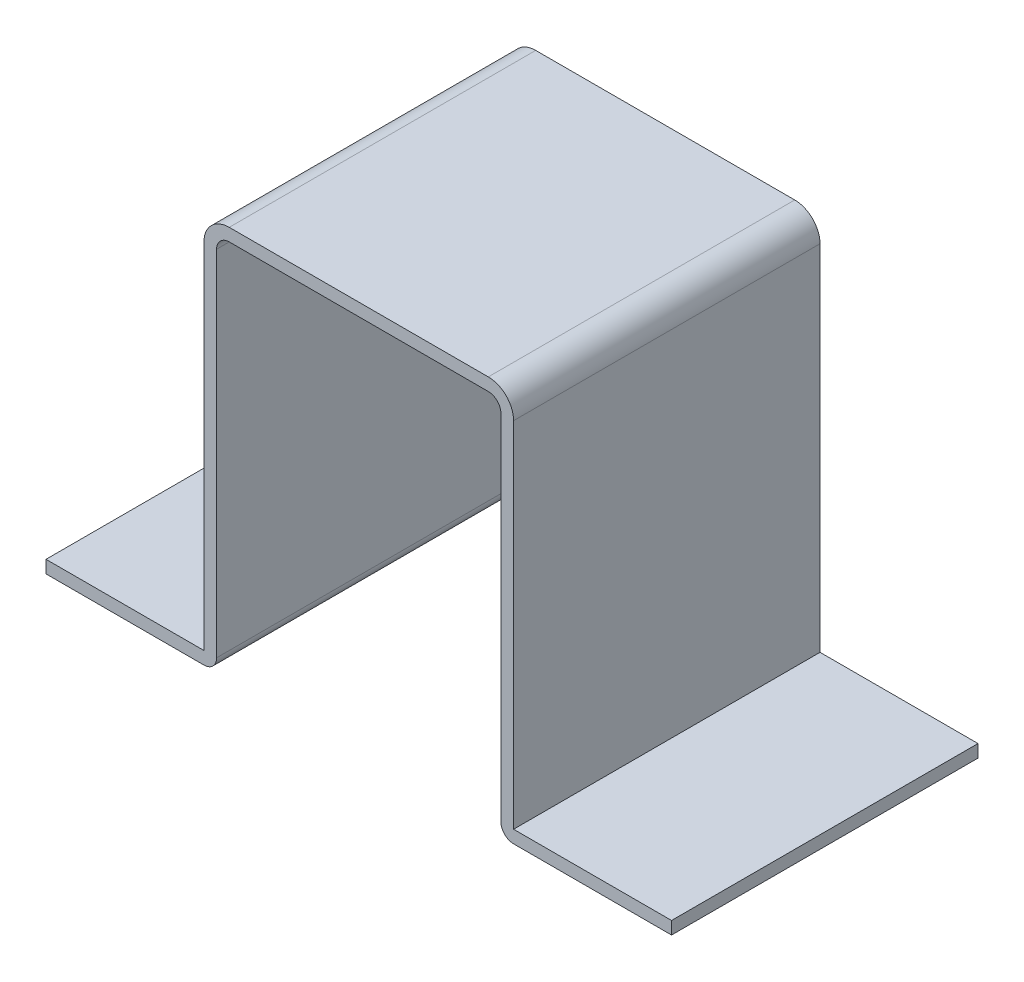
ISO-10303-21;
HEADER;
FILE_DESCRIPTION(('STEP AP214'),'2;1');
FILE_NAME('part.step','',(''),(''),'','','');
FILE_SCHEMA(('AUTOMOTIVE_DESIGN { 1 0 10303 214 1 1 1 1 }'));
ENDSEC;
DATA;
#1=APPLICATION_CONTEXT('core data for automotive mechanical design processes');
#2=APPLICATION_PROTOCOL_DEFINITION('international standard','automotive_design',2000,#1);
#3=PRODUCT_CONTEXT('',#1,'mechanical');
#4=PRODUCT('Part','Part','',(#3));
#5=PRODUCT_RELATED_PRODUCT_CATEGORY('part','',(#4));
#6=PRODUCT_DEFINITION_FORMATION('','',#4);
#7=PRODUCT_DEFINITION_CONTEXT('part definition',#1,'design');
#8=PRODUCT_DEFINITION('design','',#6,#7);
#9=PRODUCT_DEFINITION_SHAPE('','',#8);
#10=(LENGTH_UNIT() NAMED_UNIT(*) SI_UNIT(.MILLI.,.METRE.));
#11=(NAMED_UNIT(*) PLANE_ANGLE_UNIT() SI_UNIT($,.RADIAN.));
#12=(NAMED_UNIT(*) SI_UNIT($,.STERADIAN.) SOLID_ANGLE_UNIT());
#13=UNCERTAINTY_MEASURE_WITH_UNIT(LENGTH_MEASURE(1.E-05),#10,'distance_accuracy_value','');
#14=(GEOMETRIC_REPRESENTATION_CONTEXT(3) GLOBAL_UNCERTAINTY_ASSIGNED_CONTEXT((#13)) GLOBAL_UNIT_ASSIGNED_CONTEXT((#10,
#11,#12)) REPRESENTATION_CONTEXT('',''));
#15=CARTESIAN_POINT('',(0.,0.,0.));
#16=DIRECTION('',(0.,0.,1.));
#17=DIRECTION('',(1.,0.,0.));
#18=AXIS2_PLACEMENT_3D('',#15,#16,#17);
#19=CARTESIAN_POINT('',(24.5,-28.,24.25));
#20=DIRECTION('',(0.,0.,-1.));
#21=DIRECTION('',(-1.,0.,0.));
#22=AXIS2_PLACEMENT_3D('',#19,#20,#21);
#23=CYLINDRICAL_SURFACE('',#22,2.);
#24=CARTESIAN_POINT('',(24.5,-28.,24.25));
#25=DIRECTION('',(0.,0.,-1.));
#26=DIRECTION('',(-1.,0.,0.));
#27=AXIS2_PLACEMENT_3D('',#24,#25,#26);
#28=CIRCLE('',#27,2.);
#29=CARTESIAN_POINT('',(24.5,-30.,24.25));
#30=VERTEX_POINT('',#29);
#31=CARTESIAN_POINT('',(22.5,-28.,24.25));
#32=VERTEX_POINT('',#31);
#33=EDGE_CURVE('E172',#30,#32,#28,.T.);
#34=ORIENTED_EDGE('',*,*,#33,.T.);
#35=DIRECTION('',(0.,0.,-1.));
#36=VECTOR('',#35,1.);
#37=CARTESIAN_POINT('',(22.5,-28.,24.25));
#38=LINE('',#37,#36);
#39=CARTESIAN_POINT('',(22.5,-28.,-24.25));
#40=VERTEX_POINT('',#39);
#41=EDGE_CURVE('E214',#32,#40,#38,.T.);
#42=ORIENTED_EDGE('',*,*,#41,.T.);
#43=CARTESIAN_POINT('',(24.5,-28.,-24.25));
#44=DIRECTION('',(0.,0.,-1.));
#45=DIRECTION('',(-1.,0.,0.));
#46=AXIS2_PLACEMENT_3D('',#43,#44,#45);
#47=CIRCLE('',#46,2.);
#48=CARTESIAN_POINT('',(24.5,-30.,-24.25));
#49=VERTEX_POINT('',#48);
#50=EDGE_CURVE('E246',#49,#40,#47,.T.);
#51=ORIENTED_EDGE('',*,*,#50,.F.);
#52=DIRECTION('',(0.,0.,1.));
#53=VECTOR('',#52,1.);
#54=CARTESIAN_POINT('',(24.5,-30.,24.25));
#55=LINE('',#54,#53);
#56=EDGE_CURVE('E153',#49,#30,#55,.T.);
#57=ORIENTED_EDGE('',*,*,#56,.T.);
#58=EDGE_LOOP('',(#34,#42,#51,#57));
#59=FACE_BOUND('',#58,.T.);
#60=ADVANCED_FACE('F17',(#59),#23,.T.);
#61=CARTESIAN_POINT('',(22.5,-28.,24.25));
#62=DIRECTION('',(1.,0.,0.));
#63=DIRECTION('',(0.,0.,-1.));
#64=AXIS2_PLACEMENT_3D('',#61,#62,#63);
#65=PLANE('',#64);
#66=ORIENTED_EDGE('',*,*,#41,.F.);
#67=DIRECTION('',(0.,1.,0.));
#68=VECTOR('',#67,1.);
#69=CARTESIAN_POINT('',(22.5,-28.,24.25));
#70=LINE('',#69,#68);
#71=CARTESIAN_POINT('',(22.5,28.,24.25));
#72=VERTEX_POINT('',#71);
#73=EDGE_CURVE('E137',#32,#72,#70,.T.);
#74=ORIENTED_EDGE('',*,*,#73,.T.);
#75=DIRECTION('',(0.,0.,-1.));
#76=VECTOR('',#75,1.);
#77=CARTESIAN_POINT('',(22.5,28.,24.25));
#78=LINE('',#77,#76);
#79=CARTESIAN_POINT('',(22.5,28.,-24.25));
#80=VERTEX_POINT('',#79);
#81=EDGE_CURVE('E111',#72,#80,#78,.T.);
#82=ORIENTED_EDGE('',*,*,#81,.T.);
#83=DIRECTION('',(0.,1.,0.));
#84=VECTOR('',#83,1.);
#85=CARTESIAN_POINT('',(22.5,-28.,-24.25));
#86=LINE('',#85,#84);
#87=EDGE_CURVE('E245',#40,#80,#86,.T.);
#88=ORIENTED_EDGE('',*,*,#87,.F.);
#89=EDGE_LOOP('',(#66,#74,#82,#88));
#90=FACE_BOUND('',#89,.T.);
#91=ADVANCED_FACE('F318',(#90),#65,.F.);
#92=CARTESIAN_POINT('',(20.5,28.,24.25));
#93=DIRECTION('',(0.,0.,-1.));
#94=DIRECTION('',(-1.,0.,0.));
#95=AXIS2_PLACEMENT_3D('',#92,#93,#94);
#96=CYLINDRICAL_SURFACE('',#95,2.);
#97=ORIENTED_EDGE('',*,*,#81,.F.);
#98=CARTESIAN_POINT('',(20.5,28.,24.25));
#99=DIRECTION('',(0.,0.,-1.));
#100=DIRECTION('',(-1.,0.,0.));
#101=AXIS2_PLACEMENT_3D('',#98,#99,#100);
#102=CIRCLE('',#101,2.);
#103=CARTESIAN_POINT('',(20.5,30.,24.25));
#104=VERTEX_POINT('',#103);
#105=EDGE_CURVE('E20',#72,#104,#102,.F.);
#106=ORIENTED_EDGE('',*,*,#105,.T.);
#107=DIRECTION('',(0.,0.,1.));
#108=VECTOR('',#107,1.);
#109=CARTESIAN_POINT('',(20.5,30.,24.25));
#110=LINE('',#109,#108);
#111=CARTESIAN_POINT('',(20.5,30.,-24.25));
#112=VERTEX_POINT('',#111);
#113=EDGE_CURVE('E118',#104,#112,#110,.F.);
#114=ORIENTED_EDGE('',*,*,#113,.T.);
#115=CARTESIAN_POINT('',(20.5,28.,-24.25));
#116=DIRECTION('',(0.,0.,-1.));
#117=DIRECTION('',(-1.,0.,0.));
#118=AXIS2_PLACEMENT_3D('',#115,#116,#117);
#119=CIRCLE('',#118,2.);
#120=EDGE_CURVE('E243',#80,#112,#119,.F.);
#121=ORIENTED_EDGE('',*,*,#120,.F.);
#122=EDGE_LOOP('',(#97,#106,#114,#121));
#123=FACE_BOUND('',#122,.T.);
#124=ADVANCED_FACE('F136',(#123),#96,.F.);
#125=CARTESIAN_POINT('',(20.5,30.,24.25));
#126=DIRECTION('',(0.,1.,0.));
#127=DIRECTION('',(-1.,0.,0.));
#128=AXIS2_PLACEMENT_3D('',#125,#126,#127);
#129=PLANE('',#128);
#130=ORIENTED_EDGE('',*,*,#113,.F.);
#131=DIRECTION('',(-1.,0.,0.));
#132=VECTOR('',#131,1.);
#133=CARTESIAN_POINT('',(24.5,30.,24.25));
#134=LINE('',#133,#132);
#135=CARTESIAN_POINT('',(-20.5,30.,24.25));
#136=VERTEX_POINT('',#135);
#137=EDGE_CURVE('E122',#104,#136,#134,.T.);
#138=ORIENTED_EDGE('',*,*,#137,.T.);
#139=DIRECTION('',(0.,0.,-1.));
#140=VECTOR('',#139,1.);
#141=CARTESIAN_POINT('',(-20.5,30.,24.25));
#142=LINE('',#141,#140);
#143=CARTESIAN_POINT('',(-20.5,30.,-24.25));
#144=VERTEX_POINT('',#143);
#145=EDGE_CURVE('E124',#136,#144,#142,.T.);
#146=ORIENTED_EDGE('',*,*,#145,.T.);
#147=DIRECTION('',(-1.,0.,0.));
#148=VECTOR('',#147,1.);
#149=CARTESIAN_POINT('',(24.5,30.,-24.25));
#150=LINE('',#149,#148);
#151=EDGE_CURVE('E123',#112,#144,#150,.T.);
#152=ORIENTED_EDGE('',*,*,#151,.F.);
#153=EDGE_LOOP('',(#130,#138,#146,#152));
#154=FACE_BOUND('',#153,.T.);
#155=ADVANCED_FACE('F120',(#154),#129,.F.);
#156=CARTESIAN_POINT('',(-20.5,28.,24.25));
#157=DIRECTION('',(0.,0.,-1.));
#158=DIRECTION('',(-1.,0.,0.));
#159=AXIS2_PLACEMENT_3D('',#156,#157,#158);
#160=CYLINDRICAL_SURFACE('',#159,2.);
#161=ORIENTED_EDGE('',*,*,#145,.F.);
#162=CARTESIAN_POINT('',(-20.5,28.,24.25));
#163=DIRECTION('',(0.,0.,-1.));
#164=DIRECTION('',(-1.,0.,0.));
#165=AXIS2_PLACEMENT_3D('',#162,#163,#164);
#166=CIRCLE('',#165,2.);
#167=CARTESIAN_POINT('',(-22.5,28.,24.25));
#168=VERTEX_POINT('',#167);
#169=EDGE_CURVE('E134',#136,#168,#166,.F.);
#170=ORIENTED_EDGE('',*,*,#169,.T.);
#171=DIRECTION('',(0.,0.,1.));
#172=VECTOR('',#171,1.);
#173=CARTESIAN_POINT('',(-22.5,28.,24.25));
#174=LINE('',#173,#172);
#175=CARTESIAN_POINT('',(-22.5,28.,-24.25));
#176=VERTEX_POINT('',#175);
#177=EDGE_CURVE('E209',#168,#176,#174,.F.);
#178=ORIENTED_EDGE('',*,*,#177,.T.);
#179=CARTESIAN_POINT('',(-20.5,28.,-24.25));
#180=DIRECTION('',(0.,0.,-1.));
#181=DIRECTION('',(-1.,0.,0.));
#182=AXIS2_PLACEMENT_3D('',#179,#180,#181);
#183=CIRCLE('',#182,2.);
#184=EDGE_CURVE('E241',#144,#176,#183,.F.);
#185=ORIENTED_EDGE('',*,*,#184,.F.);
#186=EDGE_LOOP('',(#161,#170,#178,#185));
#187=FACE_BOUND('',#186,.T.);
#188=ADVANCED_FACE('F320',(#187),#160,.F.);
#189=CARTESIAN_POINT('',(-22.5,-28.,24.25));
#190=DIRECTION('',(-1.,0.,0.));
#191=DIRECTION('',(0.,0.,1.));
#192=AXIS2_PLACEMENT_3D('',#189,#190,#191);
#193=PLANE('',#192);
#194=ORIENTED_EDGE('',*,*,#177,.F.);
#195=DIRECTION('',(0.,1.,0.));
#196=VECTOR('',#195,1.);
#197=CARTESIAN_POINT('',(-22.5,-28.,24.25));
#198=LINE('',#197,#196);
#199=CARTESIAN_POINT('',(-22.5,-28.,24.25));
#200=VERTEX_POINT('',#199);
#201=EDGE_CURVE('E256',#168,#200,#198,.F.);
#202=ORIENTED_EDGE('',*,*,#201,.T.);
#203=DIRECTION('',(0.,0.,-1.));
#204=VECTOR('',#203,1.);
#205=CARTESIAN_POINT('',(-22.5,-28.,24.25));
#206=LINE('',#205,#204);
#207=CARTESIAN_POINT('',(-22.5,-28.,-24.25));
#208=VERTEX_POINT('',#207);
#209=EDGE_CURVE('E207',#208,#200,#206,.F.);
#210=ORIENTED_EDGE('',*,*,#209,.F.);
#211=DIRECTION('',(0.,1.,0.));
#212=VECTOR('',#211,1.);
#213=CARTESIAN_POINT('',(-22.5,-28.,-24.25));
#214=LINE('',#213,#212);
#215=EDGE_CURVE('E240',#176,#208,#214,.F.);
#216=ORIENTED_EDGE('',*,*,#215,.F.);
#217=EDGE_LOOP('',(#194,#202,#210,#216));
#218=FACE_BOUND('',#217,.T.);
#219=ADVANCED_FACE('F322',(#218),#193,.F.);
#220=CARTESIAN_POINT('',(-24.5,-28.,24.25));
#221=DIRECTION('',(0.,0.,-1.));
#222=DIRECTION('',(-1.,0.,0.));
#223=AXIS2_PLACEMENT_3D('',#220,#221,#222);
#224=CYLINDRICAL_SURFACE('',#223,2.);
#225=CARTESIAN_POINT('',(-24.5,-28.,24.25));
#226=DIRECTION('',(0.,0.,-1.));
#227=DIRECTION('',(-1.,0.,0.));
#228=AXIS2_PLACEMENT_3D('',#225,#226,#227);
#229=CIRCLE('',#228,2.);
#230=CARTESIAN_POINT('',(-24.5,-30.,24.25));
#231=VERTEX_POINT('',#230);
#232=EDGE_CURVE('E254',#200,#231,#229,.T.);
#233=ORIENTED_EDGE('',*,*,#232,.T.);
#234=DIRECTION('',(0.,0.,1.));
#235=VECTOR('',#234,1.);
#236=CARTESIAN_POINT('',(-24.5,-30.,24.25));
#237=LINE('',#236,#235);
#238=CARTESIAN_POINT('',(-24.5,-30.,-24.25));
#239=VERTEX_POINT('',#238);
#240=EDGE_CURVE('E202',#231,#239,#237,.F.);
#241=ORIENTED_EDGE('',*,*,#240,.T.);
#242=CARTESIAN_POINT('',(-24.5,-28.,-24.25));
#243=DIRECTION('',(0.,0.,-1.));
#244=DIRECTION('',(-1.,0.,0.));
#245=AXIS2_PLACEMENT_3D('',#242,#243,#244);
#246=CIRCLE('',#245,2.);
#247=EDGE_CURVE('E238',#208,#239,#246,.T.);
#248=ORIENTED_EDGE('',*,*,#247,.F.);
#249=ORIENTED_EDGE('',*,*,#209,.T.);
#250=EDGE_LOOP('',(#233,#241,#248,#249));
#251=FACE_BOUND('',#250,.T.);
#252=ADVANCED_FACE('F326',(#251),#224,.T.);
#253=CARTESIAN_POINT('',(-24.5,-30.,24.25));
#254=DIRECTION('',(0.,1.,0.));
#255=DIRECTION('',(-1.,0.,0.));
#256=AXIS2_PLACEMENT_3D('',#253,#254,#255);
#257=PLANE('',#256);
#258=ORIENTED_EDGE('',*,*,#240,.F.);
#259=DIRECTION('',(-1.,0.,0.));
#260=VECTOR('',#259,1.);
#261=CARTESIAN_POINT('',(24.5,-30.,24.25));
#262=LINE('',#261,#260);
#263=CARTESIAN_POINT('',(-49.5,-30.,24.25));
#264=VERTEX_POINT('',#263);
#265=EDGE_CURVE('E231',#231,#264,#262,.T.);
#266=ORIENTED_EDGE('',*,*,#265,.T.);
#267=DIRECTION('',(0.,0.,-1.));
#268=VECTOR('',#267,1.);
#269=CARTESIAN_POINT('',(-49.5,-30.,24.25));
#270=LINE('',#269,#268);
#271=CARTESIAN_POINT('',(-49.5,-30.,-24.25));
#272=VERTEX_POINT('',#271);
#273=EDGE_CURVE('E192',#264,#272,#270,.T.);
#274=ORIENTED_EDGE('',*,*,#273,.T.);
#275=DIRECTION('',(-1.,0.,0.));
#276=VECTOR('',#275,1.);
#277=CARTESIAN_POINT('',(24.5,-30.,-24.25));
#278=LINE('',#277,#276);
#279=EDGE_CURVE('E197',#239,#272,#278,.T.);
#280=ORIENTED_EDGE('',*,*,#279,.F.);
#281=EDGE_LOOP('',(#258,#266,#274,#280));
#282=FACE_BOUND('',#281,.T.);
#283=ADVANCED_FACE('F330',(#282),#257,.F.);
#284=CARTESIAN_POINT('',(-49.5,-28.,24.25));
#285=DIRECTION('',(1.,0.,0.));
#286=DIRECTION('',(0.,0.,-1.));
#287=AXIS2_PLACEMENT_3D('',#284,#285,#286);
#288=PLANE('',#287);
#289=ORIENTED_EDGE('',*,*,#273,.F.);
#290=DIRECTION('',(0.,1.,0.));
#291=VECTOR('',#290,1.);
#292=CARTESIAN_POINT('',(-49.5,-28.,24.25));
#293=LINE('',#292,#291);
#294=CARTESIAN_POINT('',(-49.5,-28.,24.25));
#295=VERTEX_POINT('',#294);
#296=EDGE_CURVE('E226',#264,#295,#293,.T.);
#297=ORIENTED_EDGE('',*,*,#296,.T.);
#298=DIRECTION('',(0.,0.,1.));
#299=VECTOR('',#298,1.);
#300=CARTESIAN_POINT('',(-49.5,-28.,24.25));
#301=LINE('',#300,#299);
#302=CARTESIAN_POINT('',(-49.5,-28.,-24.25));
#303=VERTEX_POINT('',#302);
#304=EDGE_CURVE('E180',#295,#303,#301,.F.);
#305=ORIENTED_EDGE('',*,*,#304,.T.);
#306=DIRECTION('',(0.,1.,0.));
#307=VECTOR('',#306,1.);
#308=CARTESIAN_POINT('',(-49.5,-28.,-24.25));
#309=LINE('',#308,#307);
#310=EDGE_CURVE('E187',#272,#303,#309,.T.);
#311=ORIENTED_EDGE('',*,*,#310,.F.);
#312=EDGE_LOOP('',(#289,#297,#305,#311));
#313=FACE_BOUND('',#312,.T.);
#314=ADVANCED_FACE('F337',(#313),#288,.F.);
#315=CARTESIAN_POINT('',(-24.5,-28.,24.25));
#316=DIRECTION('',(0.,-1.,0.));
#317=DIRECTION('',(1.,0.,0.));
#318=AXIS2_PLACEMENT_3D('',#315,#316,#317);
#319=PLANE('',#318);
#320=ORIENTED_EDGE('',*,*,#304,.F.);
#321=DIRECTION('',(-1.,0.,0.));
#322=VECTOR('',#321,1.);
#323=CARTESIAN_POINT('',(24.5,-28.,24.25));
#324=LINE('',#323,#322);
#325=CARTESIAN_POINT('',(-24.5,-28.,24.25));
#326=VERTEX_POINT('',#325);
#327=EDGE_CURVE('E222',#295,#326,#324,.F.);
#328=ORIENTED_EDGE('',*,*,#327,.T.);
#329=DIRECTION('',(0.,0.,-1.));
#330=VECTOR('',#329,1.);
#331=CARTESIAN_POINT('',(-24.5,-28.,24.25));
#332=LINE('',#331,#330);
#333=CARTESIAN_POINT('',(-24.5,-28.,-24.25));
#334=VERTEX_POINT('',#333);
#335=EDGE_CURVE('E177',#326,#334,#332,.T.);
#336=ORIENTED_EDGE('',*,*,#335,.T.);
#337=DIRECTION('',(-1.,0.,0.));
#338=VECTOR('',#337,1.);
#339=CARTESIAN_POINT('',(24.5,-28.,-24.25));
#340=LINE('',#339,#338);
#341=EDGE_CURVE('E183',#303,#334,#340,.F.);
#342=ORIENTED_EDGE('',*,*,#341,.F.);
#343=EDGE_LOOP('',(#320,#328,#336,#342));
#344=FACE_BOUND('',#343,.T.);
#345=ADVANCED_FACE('F355',(#344),#319,.F.);
#346=CARTESIAN_POINT('',(-24.5,-28.,24.25));
#347=DIRECTION('',(1.,0.,0.));
#348=DIRECTION('',(0.,0.,-1.));
#349=AXIS2_PLACEMENT_3D('',#346,#347,#348);
#350=PLANE('',#349);
#351=ORIENTED_EDGE('',*,*,#335,.F.);
#352=DIRECTION('',(0.,1.,0.));
#353=VECTOR('',#352,1.);
#354=CARTESIAN_POINT('',(-24.5,-28.,24.25));
#355=LINE('',#354,#353);
#356=CARTESIAN_POINT('',(-24.5,28.,24.25));
#357=VERTEX_POINT('',#356);
#358=EDGE_CURVE('E225',#326,#357,#355,.T.);
#359=ORIENTED_EDGE('',*,*,#358,.T.);
#360=DIRECTION('',(0.,0.,-1.));
#361=VECTOR('',#360,1.);
#362=CARTESIAN_POINT('',(-24.5,28.,24.25));
#363=LINE('',#362,#361);
#364=CARTESIAN_POINT('',(-24.5,28.,-24.25));
#365=VERTEX_POINT('',#364);
#366=EDGE_CURVE('E175',#365,#357,#363,.F.);
#367=ORIENTED_EDGE('',*,*,#366,.F.);
#368=DIRECTION('',(0.,1.,0.));
#369=VECTOR('',#368,1.);
#370=CARTESIAN_POINT('',(-24.5,-28.,-24.25));
#371=LINE('',#370,#369);
#372=EDGE_CURVE('E186',#334,#365,#371,.T.);
#373=ORIENTED_EDGE('',*,*,#372,.F.);
#374=EDGE_LOOP('',(#351,#359,#367,#373));
#375=FACE_BOUND('',#374,.T.);
#376=ADVANCED_FACE('F351',(#375),#350,.F.);
#377=CARTESIAN_POINT('',(-20.5,28.,24.25));
#378=DIRECTION('',(0.,0.,-1.));
#379=DIRECTION('',(-1.,0.,0.));
#380=AXIS2_PLACEMENT_3D('',#377,#378,#379);
#381=CYLINDRICAL_SURFACE('',#380,4.);
#382=CARTESIAN_POINT('',(-20.5,28.,24.25));
#383=DIRECTION('',(0.,0.,-1.));
#384=DIRECTION('',(-1.,0.,0.));
#385=AXIS2_PLACEMENT_3D('',#382,#383,#384);
#386=CIRCLE('',#385,4.);
#387=CARTESIAN_POINT('',(-20.5,32.,24.25));
#388=VERTEX_POINT('',#387);
#389=EDGE_CURVE('E251',#357,#388,#386,.T.);
#390=ORIENTED_EDGE('',*,*,#389,.T.);
#391=DIRECTION('',(0.,0.,-1.));
#392=VECTOR('',#391,1.);
#393=CARTESIAN_POINT('',(-20.5,32.,24.25));
#394=LINE('',#393,#392);
#395=CARTESIAN_POINT('',(-20.5,32.,-24.25));
#396=VERTEX_POINT('',#395);
#397=EDGE_CURVE('E155',#388,#396,#394,.T.);
#398=ORIENTED_EDGE('',*,*,#397,.T.);
#399=CARTESIAN_POINT('',(-20.5,28.,-24.25));
#400=DIRECTION('',(0.,0.,-1.));
#401=DIRECTION('',(-1.,0.,0.));
#402=AXIS2_PLACEMENT_3D('',#399,#400,#401);
#403=CIRCLE('',#402,4.);
#404=EDGE_CURVE('E236',#365,#396,#403,.T.);
#405=ORIENTED_EDGE('',*,*,#404,.F.);
#406=ORIENTED_EDGE('',*,*,#366,.T.);
#407=EDGE_LOOP('',(#390,#398,#405,#406));
#408=FACE_BOUND('',#407,.T.);
#409=ADVANCED_FACE('F363',(#408),#381,.T.);
#410=CARTESIAN_POINT('',(20.5,32.,24.25));
#411=DIRECTION('',(0.,-1.,0.));
#412=DIRECTION('',(0.,0.,-1.));
#413=AXIS2_PLACEMENT_3D('',#410,#411,#412);
#414=PLANE('',#413);
#415=ORIENTED_EDGE('',*,*,#397,.F.);
#416=DIRECTION('',(-1.,0.,0.));
#417=VECTOR('',#416,1.);
#418=CARTESIAN_POINT('',(24.5,32.,24.25));
#419=LINE('',#418,#417);
#420=CARTESIAN_POINT('',(20.5,32.,24.25));
#421=VERTEX_POINT('',#420);
#422=EDGE_CURVE('E150',#388,#421,#419,.F.);
#423=ORIENTED_EDGE('',*,*,#422,.T.);
#424=DIRECTION('',(0.,0.,-1.));
#425=VECTOR('',#424,1.);
#426=CARTESIAN_POINT('',(20.5,32.,24.25));
#427=LINE('',#426,#425);
#428=CARTESIAN_POINT('',(20.5,32.,-24.25));
#429=VERTEX_POINT('',#428);
#430=EDGE_CURVE('E169',#429,#421,#427,.F.);
#431=ORIENTED_EDGE('',*,*,#430,.F.);
#432=DIRECTION('',(-1.,0.,0.));
#433=VECTOR('',#432,1.);
#434=CARTESIAN_POINT('',(24.5,32.,-24.25));
#435=LINE('',#434,#433);
#436=EDGE_CURVE('E235',#396,#429,#435,.F.);
#437=ORIENTED_EDGE('',*,*,#436,.F.);
#438=EDGE_LOOP('',(#415,#423,#431,#437));
#439=FACE_BOUND('',#438,.T.);
#440=ADVANCED_FACE('F392',(#439),#414,.F.);
#441=CARTESIAN_POINT('',(49.5,-28.,24.25));
#442=DIRECTION('',(-1.,0.,0.));
#443=DIRECTION('',(0.,0.,1.));
#444=AXIS2_PLACEMENT_3D('',#441,#442,#443);
#445=PLANE('',#444);
#446=DIRECTION('',(0.,0.,-1.));
#447=VECTOR('',#446,1.);
#448=CARTESIAN_POINT('',(49.5,-28.,24.25));
#449=LINE('',#448,#447);
#450=CARTESIAN_POINT('',(49.5,-28.,-24.25));
#451=VERTEX_POINT('',#450);
#452=CARTESIAN_POINT('',(49.5,-28.,24.25));
#453=VERTEX_POINT('',#452);
#454=EDGE_CURVE('E138',#451,#453,#449,.F.);
#455=ORIENTED_EDGE('',*,*,#454,.T.);
#456=DIRECTION('',(0.,1.,0.));
#457=VECTOR('',#456,1.);
#458=CARTESIAN_POINT('',(49.5,-28.,24.25));
#459=LINE('',#458,#457);
#460=CARTESIAN_POINT('',(49.5,-30.,24.25));
#461=VERTEX_POINT('',#460);
#462=EDGE_CURVE('E149',#453,#461,#459,.F.);
#463=ORIENTED_EDGE('',*,*,#462,.T.);
#464=DIRECTION('',(0.,0.,1.));
#465=VECTOR('',#464,1.);
#466=CARTESIAN_POINT('',(49.5,-30.,24.25));
#467=LINE('',#466,#465);
#468=CARTESIAN_POINT('',(49.5,-30.,-24.25));
#469=VERTEX_POINT('',#468);
#470=EDGE_CURVE('E142',#461,#469,#467,.F.);
#471=ORIENTED_EDGE('',*,*,#470,.T.);
#472=DIRECTION('',(0.,1.,0.));
#473=VECTOR('',#472,1.);
#474=CARTESIAN_POINT('',(49.5,-28.,-24.25));
#475=LINE('',#474,#473);
#476=EDGE_CURVE('E160',#451,#469,#475,.F.);
#477=ORIENTED_EDGE('',*,*,#476,.F.);
#478=EDGE_LOOP('',(#455,#463,#471,#477));
#479=FACE_BOUND('',#478,.T.);
#480=ADVANCED_FACE('F389',(#479),#445,.F.);
#481=CARTESIAN_POINT('',(24.5,-30.,24.25));
#482=DIRECTION('',(0.,1.,0.));
#483=DIRECTION('',(-1.,0.,0.));
#484=AXIS2_PLACEMENT_3D('',#481,#482,#483);
#485=PLANE('',#484);
#486=ORIENTED_EDGE('',*,*,#470,.F.);
#487=DIRECTION('',(-1.,0.,0.));
#488=VECTOR('',#487,1.);
#489=CARTESIAN_POINT('',(24.5,-30.,24.25));
#490=LINE('',#489,#488);
#491=EDGE_CURVE('E219',#461,#30,#490,.T.);
#492=ORIENTED_EDGE('',*,*,#491,.T.);
#493=ORIENTED_EDGE('',*,*,#56,.F.);
#494=DIRECTION('',(-1.,0.,0.));
#495=VECTOR('',#494,1.);
#496=CARTESIAN_POINT('',(24.5,-30.,-24.25));
#497=LINE('',#496,#495);
#498=EDGE_CURVE('E163',#469,#49,#497,.T.);
#499=ORIENTED_EDGE('',*,*,#498,.F.);
#500=EDGE_LOOP('',(#486,#492,#493,#499));
#501=FACE_BOUND('',#500,.T.);
#502=ADVANCED_FACE('F385',(#501),#485,.F.);
#503=CARTESIAN_POINT('',(24.5,-28.,24.25));
#504=DIRECTION('',(0.,-1.,0.));
#505=DIRECTION('',(0.,0.,-1.));
#506=AXIS2_PLACEMENT_3D('',#503,#504,#505);
#507=PLANE('',#506);
#508=DIRECTION('',(0.,0.,1.));
#509=VECTOR('',#508,1.);
#510=CARTESIAN_POINT('',(24.5,-28.,24.25));
#511=LINE('',#510,#509);
#512=CARTESIAN_POINT('',(24.5,-28.,-24.25));
#513=VERTEX_POINT('',#512);
#514=CARTESIAN_POINT('',(24.5,-28.,24.25));
#515=VERTEX_POINT('',#514);
#516=EDGE_CURVE('E281',#513,#515,#511,.T.);
#517=ORIENTED_EDGE('',*,*,#516,.T.);
#518=DIRECTION('',(-1.,0.,0.));
#519=VECTOR('',#518,1.);
#520=CARTESIAN_POINT('',(24.5,-28.,24.25));
#521=LINE('',#520,#519);
#522=EDGE_CURVE('E146',#515,#453,#521,.F.);
#523=ORIENTED_EDGE('',*,*,#522,.T.);
#524=ORIENTED_EDGE('',*,*,#454,.F.);
#525=DIRECTION('',(-1.,0.,0.));
#526=VECTOR('',#525,1.);
#527=CARTESIAN_POINT('',(24.5,-28.,-24.25));
#528=LINE('',#527,#526);
#529=EDGE_CURVE('E164',#513,#451,#528,.F.);
#530=ORIENTED_EDGE('',*,*,#529,.F.);
#531=EDGE_LOOP('',(#517,#523,#524,#530));
#532=FACE_BOUND('',#531,.T.);
#533=ADVANCED_FACE('F382',(#532),#507,.F.);
#534=CARTESIAN_POINT('',(24.5,-28.,24.25));
#535=DIRECTION('',(0.,0.,-1.));
#536=DIRECTION('',(-1.,0.,0.));
#537=AXIS2_PLACEMENT_3D('',#534,#535,#536);
#538=PLANE('',#537);
#539=ORIENTED_EDGE('',*,*,#491,.F.);
#540=ORIENTED_EDGE('',*,*,#462,.F.);
#541=ORIENTED_EDGE('',*,*,#522,.F.);
#542=DIRECTION('',(0.,-1.,0.));
#543=VECTOR('',#542,1.);
#544=CARTESIAN_POINT('',(24.5,-28.,24.25));
#545=LINE('',#544,#543);
#546=CARTESIAN_POINT('',(24.5,28.,24.25));
#547=VERTEX_POINT('',#546);
#548=EDGE_CURVE('E278',#515,#547,#545,.F.);
#549=ORIENTED_EDGE('',*,*,#548,.T.);
#550=CARTESIAN_POINT('',(20.5,28.,24.25));
#551=DIRECTION('',(0.,0.,-1.));
#552=DIRECTION('',(-1.,0.,0.));
#553=AXIS2_PLACEMENT_3D('',#550,#551,#552);
#554=CIRCLE('',#553,4.);
#555=EDGE_CURVE('E171',#421,#547,#554,.T.);
#556=ORIENTED_EDGE('',*,*,#555,.F.);
#557=ORIENTED_EDGE('',*,*,#422,.F.);
#558=ORIENTED_EDGE('',*,*,#389,.F.);
#559=ORIENTED_EDGE('',*,*,#358,.F.);
#560=ORIENTED_EDGE('',*,*,#327,.F.);
#561=ORIENTED_EDGE('',*,*,#296,.F.);
#562=ORIENTED_EDGE('',*,*,#265,.F.);
#563=ORIENTED_EDGE('',*,*,#232,.F.);
#564=ORIENTED_EDGE('',*,*,#201,.F.);
#565=ORIENTED_EDGE('',*,*,#169,.F.);
#566=ORIENTED_EDGE('',*,*,#137,.F.);
#567=ORIENTED_EDGE('',*,*,#105,.F.);
#568=ORIENTED_EDGE('',*,*,#73,.F.);
#569=ORIENTED_EDGE('',*,*,#33,.F.);
#570=EDGE_LOOP('',(#539,#540,#541,#549,#556,#557,#558,#559,#560,#561,#562,#563,#564,#565,#566,
#567,#568,#569));
#571=FACE_BOUND('',#570,.T.);
#572=ADVANCED_FACE('F129',(#571),#538,.F.);
#573=CARTESIAN_POINT('',(20.5,28.,24.25));
#574=DIRECTION('',(0.,0.,-1.));
#575=DIRECTION('',(-1.,0.,0.));
#576=AXIS2_PLACEMENT_3D('',#573,#574,#575);
#577=CYLINDRICAL_SURFACE('',#576,4.);
#578=ORIENTED_EDGE('',*,*,#555,.T.);
#579=DIRECTION('',(0.,0.,1.));
#580=VECTOR('',#579,1.);
#581=CARTESIAN_POINT('',(24.5,28.,24.25));
#582=LINE('',#581,#580);
#583=CARTESIAN_POINT('',(24.5,28.,-24.25));
#584=VERTEX_POINT('',#583);
#585=EDGE_CURVE('E26',#547,#584,#582,.F.);
#586=ORIENTED_EDGE('',*,*,#585,.T.);
#587=CARTESIAN_POINT('',(20.5,28.,-24.25));
#588=DIRECTION('',(0.,0.,-1.));
#589=DIRECTION('',(-1.,0.,0.));
#590=AXIS2_PLACEMENT_3D('',#587,#588,#589);
#591=CIRCLE('',#590,4.);
#592=EDGE_CURVE('E34',#429,#584,#591,.T.);
#593=ORIENTED_EDGE('',*,*,#592,.F.);
#594=ORIENTED_EDGE('',*,*,#430,.T.);
#595=EDGE_LOOP('',(#578,#586,#593,#594));
#596=FACE_BOUND('',#595,.T.);
#597=ADVANCED_FACE('F373',(#596),#577,.T.);
#598=CARTESIAN_POINT('',(24.5,-28.,-24.25));
#599=DIRECTION('',(0.,0.,-1.));
#600=DIRECTION('',(-1.,0.,0.));
#601=AXIS2_PLACEMENT_3D('',#598,#599,#600);
#602=PLANE('',#601);
#603=ORIENTED_EDGE('',*,*,#476,.T.);
#604=ORIENTED_EDGE('',*,*,#498,.T.);
#605=ORIENTED_EDGE('',*,*,#50,.T.);
#606=ORIENTED_EDGE('',*,*,#87,.T.);
#607=ORIENTED_EDGE('',*,*,#120,.T.);
#608=ORIENTED_EDGE('',*,*,#151,.T.);
#609=ORIENTED_EDGE('',*,*,#184,.T.);
#610=ORIENTED_EDGE('',*,*,#215,.T.);
#611=ORIENTED_EDGE('',*,*,#247,.T.);
#612=ORIENTED_EDGE('',*,*,#279,.T.);
#613=ORIENTED_EDGE('',*,*,#310,.T.);
#614=ORIENTED_EDGE('',*,*,#341,.T.);
#615=ORIENTED_EDGE('',*,*,#372,.T.);
#616=ORIENTED_EDGE('',*,*,#404,.T.);
#617=ORIENTED_EDGE('',*,*,#436,.T.);
#618=ORIENTED_EDGE('',*,*,#592,.T.);
#619=DIRECTION('',(0.,-1.,0.));
#620=VECTOR('',#619,1.);
#621=CARTESIAN_POINT('',(24.5,-28.,-24.25));
#622=LINE('',#621,#620);
#623=EDGE_CURVE('E11',#584,#513,#622,.T.);
#624=ORIENTED_EDGE('',*,*,#623,.T.);
#625=ORIENTED_EDGE('',*,*,#529,.T.);
#626=EDGE_LOOP('',(#603,#604,#605,#606,#607,#608,#609,#610,#611,#612,#613,#614,#615,#616,#617,
#618,#624,#625));
#627=FACE_BOUND('',#626,.T.);
#628=ADVANCED_FACE('F310',(#627),#602,.T.);
#629=CARTESIAN_POINT('',(24.5,-28.,24.25));
#630=DIRECTION('',(-1.,0.,0.));
#631=DIRECTION('',(0.,-1.,0.));
#632=AXIS2_PLACEMENT_3D('',#629,#630,#631);
#633=PLANE('',#632);
#634=ORIENTED_EDGE('',*,*,#585,.F.);
#635=ORIENTED_EDGE('',*,*,#548,.F.);
#636=ORIENTED_EDGE('',*,*,#516,.F.);
#637=ORIENTED_EDGE('',*,*,#623,.F.);
#638=EDGE_LOOP('',(#634,#635,#636,#637));
#639=FACE_BOUND('',#638,.T.);
#640=ADVANCED_FACE('F366',(#639),#633,.F.);
#641=CLOSED_SHELL('',(#60,#91,#124,#155,#188,#219,#252,#283,#314,#345,#376,#409,#440,#480,#502,
#533,#572,#597,#628,#640));
#642=MANIFOLD_SOLID_BREP('B1',#641);
#643=ADVANCED_BREP_SHAPE_REPRESENTATION('',(#18,#642),#14);
#644=SHAPE_DEFINITION_REPRESENTATION(#9,#643);
ENDSEC;
END-ISO-10303-21;
